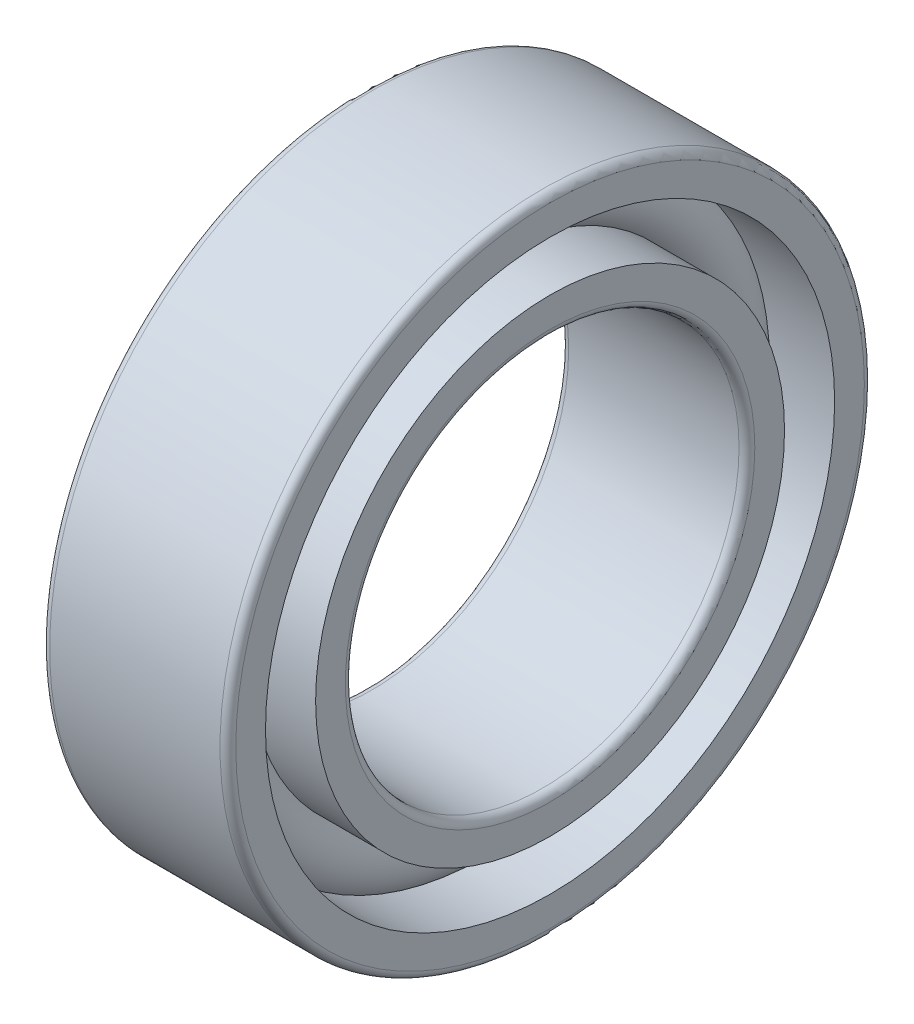
ISO-10303-21;
HEADER;
FILE_DESCRIPTION(('STEP AP214'),'2;1');
FILE_NAME('part.step','',(''),(''),'','','');
FILE_SCHEMA(('AUTOMOTIVE_DESIGN { 1 0 10303 214 1 1 1 1 }'));
ENDSEC;
DATA;
#1=APPLICATION_CONTEXT('core data for automotive mechanical design processes');
#2=APPLICATION_PROTOCOL_DEFINITION('international standard','automotive_design',2000,#1);
#3=PRODUCT_CONTEXT('',#1,'mechanical');
#4=PRODUCT('Part','Part','',(#3));
#5=PRODUCT_RELATED_PRODUCT_CATEGORY('part','',(#4));
#6=PRODUCT_DEFINITION_FORMATION('','',#4);
#7=PRODUCT_DEFINITION_CONTEXT('part definition',#1,'design');
#8=PRODUCT_DEFINITION('design','',#6,#7);
#9=PRODUCT_DEFINITION_SHAPE('','',#8);
#10=(LENGTH_UNIT() NAMED_UNIT(*) SI_UNIT(.MILLI.,.METRE.));
#11=(NAMED_UNIT(*) PLANE_ANGLE_UNIT() SI_UNIT($,.RADIAN.));
#12=(NAMED_UNIT(*) SI_UNIT($,.STERADIAN.) SOLID_ANGLE_UNIT());
#13=UNCERTAINTY_MEASURE_WITH_UNIT(LENGTH_MEASURE(1.E-05),#10,'distance_accuracy_value','');
#14=(GEOMETRIC_REPRESENTATION_CONTEXT(3) GLOBAL_UNCERTAINTY_ASSIGNED_CONTEXT((#13)) GLOBAL_UNIT_ASSIGNED_CONTEXT((#10,
#11,#12)) REPRESENTATION_CONTEXT('',''));
#15=CARTESIAN_POINT('',(0.,0.,0.));
#16=DIRECTION('',(0.,0.,1.));
#17=DIRECTION('',(1.,0.,0.));
#18=AXIS2_PLACEMENT_3D('',#15,#16,#17);
#19=CARTESIAN_POINT('',(0.,0.,0.));
#20=DIRECTION('',(-1.,0.,0.));
#21=DIRECTION('',(0.,0.,1.));
#22=AXIS2_PLACEMENT_3D('',#19,#20,#21);
#23=TOROIDAL_SURFACE('',#22,36.25,5.25);
#24=CARTESIAN_POINT('',(3.91311896062462,0.,0.));
#25=DIRECTION('',(-1.,0.,0.));
#26=DIRECTION('',(0.,0.,1.));
#27=AXIS2_PLACEMENT_3D('',#24,#25,#26);
#28=CIRCLE('',#27,39.75);
#29=CARTESIAN_POINT('',(3.91311896062462,0.,39.75));
#30=VERTEX_POINT('',#29);
#31=EDGE_CURVE('E35',#30,#30,#28,.F.);
#32=ORIENTED_EDGE('',*,*,#31,.T.);
#33=EDGE_LOOP('',(#32));
#34=FACE_BOUND('',#33,.T.);
#35=CARTESIAN_POINT('',(3.91311896062463,0.,0.));
#36=DIRECTION('',(-1.,0.,0.));
#37=DIRECTION('',(0.,0.,1.));
#38=AXIS2_PLACEMENT_3D('',#35,#36,#37);
#39=CIRCLE('',#38,32.75);
#40=CARTESIAN_POINT('',(3.91311896062463,0.,32.75));
#41=VERTEX_POINT('',#40);
#42=EDGE_CURVE('E10',#41,#41,#39,.T.);
#43=ORIENTED_EDGE('',*,*,#42,.T.);
#44=EDGE_LOOP('',(#43));
#45=FACE_BOUND('',#44,.T.);
#46=ADVANCED_FACE('F31',(#34,#45),#23,.T.);
#47=CARTESIAN_POINT('',(-20.6375,0.,0.));
#48=DIRECTION('',(1.,0.,0.));
#49=DIRECTION('',(0.,0.,-1.));
#50=AXIS2_PLACEMENT_3D('',#47,#48,#49);
#51=CYLINDRICAL_SURFACE('',#50,32.75);
#52=CARTESIAN_POINT('',(13.,0.,0.));
#53=DIRECTION('',(1.,0.,0.));
#54=DIRECTION('',(0.,0.,-1.));
#55=AXIS2_PLACEMENT_3D('',#52,#53,#54);
#56=CIRCLE('',#55,32.75);
#57=CARTESIAN_POINT('',(13.,0.,-32.75));
#58=VERTEX_POINT('',#57);
#59=EDGE_CURVE('E44',#58,#58,#56,.T.);
#60=ORIENTED_EDGE('',*,*,#59,.F.);
#61=EDGE_LOOP('',(#60));
#62=FACE_BOUND('',#61,.T.);
#63=ORIENTED_EDGE('',*,*,#42,.F.);
#64=EDGE_LOOP('',(#63));
#65=FACE_BOUND('',#64,.T.);
#66=ADVANCED_FACE('F83',(#62,#65),#51,.T.);
#67=CARTESIAN_POINT('',(-20.6375,0.,0.));
#68=DIRECTION('',(1.,0.,0.));
#69=DIRECTION('',(0.,0.,-1.));
#70=AXIS2_PLACEMENT_3D('',#67,#68,#69);
#71=CYLINDRICAL_SURFACE('',#70,32.75);
#72=CARTESIAN_POINT('',(-13.,0.,0.));
#73=DIRECTION('',(1.,0.,0.));
#74=DIRECTION('',(0.,0.,-1.));
#75=AXIS2_PLACEMENT_3D('',#72,#73,#74);
#76=CIRCLE('',#75,32.75);
#77=CARTESIAN_POINT('',(-13.,0.,-32.75));
#78=VERTEX_POINT('',#77);
#79=EDGE_CURVE('E53',#78,#78,#76,.T.);
#80=ORIENTED_EDGE('',*,*,#79,.T.);
#81=EDGE_LOOP('',(#80));
#82=FACE_BOUND('',#81,.T.);
#83=CARTESIAN_POINT('',(-3.91311896062463,0.,0.));
#84=DIRECTION('',(1.,0.,0.));
#85=DIRECTION('',(0.,0.,-1.));
#86=AXIS2_PLACEMENT_3D('',#83,#84,#85);
#87=CIRCLE('',#86,32.75);
#88=CARTESIAN_POINT('',(-3.91311896062463,0.,-32.75));
#89=VERTEX_POINT('',#88);
#90=EDGE_CURVE('E39',#89,#89,#87,.T.);
#91=ORIENTED_EDGE('',*,*,#90,.F.);
#92=EDGE_LOOP('',(#91));
#93=FACE_BOUND('',#92,.T.);
#94=ADVANCED_FACE('F86',(#82,#93),#71,.T.);
#95=CARTESIAN_POINT('',(13.,28.6,0.));
#96=DIRECTION('',(1.,0.,0.));
#97=DIRECTION('',(0.,0.,-1.));
#98=AXIS2_PLACEMENT_3D('',#95,#96,#97);
#99=PLANE('',#98);
#100=ORIENTED_EDGE('',*,*,#59,.T.);
#101=EDGE_LOOP('',(#100));
#102=FACE_BOUND('',#101,.T.);
#103=CARTESIAN_POINT('',(13.,0.,0.));
#104=DIRECTION('',(1.,0.,0.));
#105=DIRECTION('',(0.,0.,-1.));
#106=AXIS2_PLACEMENT_3D('',#103,#104,#105);
#107=CIRCLE('',#106,28.6);
#108=CARTESIAN_POINT('',(13.,0.,-28.6));
#109=VERTEX_POINT('',#108);
#110=EDGE_CURVE('E75',#109,#109,#107,.T.);
#111=ORIENTED_EDGE('',*,*,#110,.F.);
#112=EDGE_LOOP('',(#111));
#113=FACE_BOUND('',#112,.T.);
#114=ADVANCED_FACE('F80',(#102,#113),#99,.T.);
#115=CARTESIAN_POINT('',(11.9,0.,0.));
#116=DIRECTION('',(1.,0.,0.));
#117=DIRECTION('',(0.,0.,-1.));
#118=AXIS2_PLACEMENT_3D('',#115,#116,#117);
#119=TOROIDAL_SURFACE('',#118,28.6,1.1);
#120=ORIENTED_EDGE('',*,*,#110,.T.);
#121=EDGE_LOOP('',(#120));
#122=FACE_BOUND('',#121,.T.);
#123=CARTESIAN_POINT('',(11.9,0.,0.));
#124=DIRECTION('',(1.,0.,0.));
#125=DIRECTION('',(0.,0.,-1.));
#126=AXIS2_PLACEMENT_3D('',#123,#124,#125);
#127=CIRCLE('',#126,27.5);
#128=CARTESIAN_POINT('',(11.9,0.,-27.5));
#129=VERTEX_POINT('',#128);
#130=EDGE_CURVE('E72',#129,#129,#127,.T.);
#131=ORIENTED_EDGE('',*,*,#130,.F.);
#132=EDGE_LOOP('',(#131));
#133=FACE_BOUND('',#132,.T.);
#134=ADVANCED_FACE('F97',(#122,#133),#119,.T.);
#135=CARTESIAN_POINT('',(-20.6375,0.,0.));
#136=DIRECTION('',(1.,0.,0.));
#137=DIRECTION('',(0.,0.,-1.));
#138=AXIS2_PLACEMENT_3D('',#135,#136,#137);
#139=CYLINDRICAL_SURFACE('',#138,27.5);
#140=ORIENTED_EDGE('',*,*,#130,.T.);
#141=EDGE_LOOP('',(#140));
#142=FACE_BOUND('',#141,.T.);
#143=CARTESIAN_POINT('',(-11.9,0.,0.));
#144=DIRECTION('',(1.,0.,0.));
#145=DIRECTION('',(0.,0.,-1.));
#146=AXIS2_PLACEMENT_3D('',#143,#144,#145);
#147=CIRCLE('',#146,27.5);
#148=CARTESIAN_POINT('',(-11.9,0.,-27.5));
#149=VERTEX_POINT('',#148);
#150=EDGE_CURVE('E69',#149,#149,#147,.T.);
#151=ORIENTED_EDGE('',*,*,#150,.F.);
#152=EDGE_LOOP('',(#151));
#153=FACE_BOUND('',#152,.T.);
#154=ADVANCED_FACE('F100',(#142,#153),#139,.F.);
#155=CARTESIAN_POINT('',(-11.9,0.,0.));
#156=DIRECTION('',(1.,0.,0.));
#157=DIRECTION('',(0.,0.,-1.));
#158=AXIS2_PLACEMENT_3D('',#155,#156,#157);
#159=TOROIDAL_SURFACE('',#158,28.6,1.1);
#160=ORIENTED_EDGE('',*,*,#150,.T.);
#161=EDGE_LOOP('',(#160));
#162=FACE_BOUND('',#161,.T.);
#163=CARTESIAN_POINT('',(-13.,0.,0.));
#164=DIRECTION('',(1.,0.,0.));
#165=DIRECTION('',(0.,0.,-1.));
#166=AXIS2_PLACEMENT_3D('',#163,#164,#165);
#167=CIRCLE('',#166,28.6);
#168=CARTESIAN_POINT('',(-13.,0.,-28.6));
#169=VERTEX_POINT('',#168);
#170=EDGE_CURVE('E66',#169,#169,#167,.T.);
#171=ORIENTED_EDGE('',*,*,#170,.F.);
#172=EDGE_LOOP('',(#171));
#173=FACE_BOUND('',#172,.T.);
#174=ADVANCED_FACE('F104',(#162,#173),#159,.T.);
#175=CARTESIAN_POINT('',(-13.,32.75,0.));
#176=DIRECTION('',(-1.,0.,0.));
#177=DIRECTION('',(0.,0.,1.));
#178=AXIS2_PLACEMENT_3D('',#175,#176,#177);
#179=PLANE('',#178);
#180=ORIENTED_EDGE('',*,*,#170,.T.);
#181=EDGE_LOOP('',(#180));
#182=FACE_BOUND('',#181,.T.);
#183=ORIENTED_EDGE('',*,*,#79,.F.);
#184=EDGE_LOOP('',(#183));
#185=FACE_BOUND('',#184,.T.);
#186=ADVANCED_FACE('F108',(#182,#185),#179,.T.);
#187=CARTESIAN_POINT('',(-3.91311896062462,0.,0.));
#188=DIRECTION('',(1.,0.,0.));
#189=DIRECTION('',(0.,0.,-1.));
#190=AXIS2_PLACEMENT_3D('',#187,#188,#189);
#191=CIRCLE('',#190,39.75);
#192=CARTESIAN_POINT('',(-3.91311896062462,0.,-39.75));
#193=VERTEX_POINT('',#192);
#194=EDGE_CURVE('E47',#193,#193,#191,.F.);
#195=ORIENTED_EDGE('',*,*,#194,.T.);
#196=EDGE_LOOP('',(#195));
#197=FACE_BOUND('',#196,.T.);
#198=ORIENTED_EDGE('',*,*,#90,.T.);
#199=EDGE_LOOP('',(#198));
#200=FACE_BOUND('',#199,.T.);
#201=ADVANCED_FACE('F33',(#197,#200),#23,.T.);
#202=CARTESIAN_POINT('',(-20.6375,0.,0.));
#203=DIRECTION('',(1.,0.,0.));
#204=DIRECTION('',(0.,0.,-1.));
#205=AXIS2_PLACEMENT_3D('',#202,#203,#204);
#206=CYLINDRICAL_SURFACE('',#205,39.75);
#207=CARTESIAN_POINT('',(13.,0.,0.));
#208=DIRECTION('',(1.,0.,0.));
#209=DIRECTION('',(0.,0.,-1.));
#210=AXIS2_PLACEMENT_3D('',#207,#208,#209);
#211=CIRCLE('',#210,39.75);
#212=CARTESIAN_POINT('',(13.,0.,-39.75));
#213=VERTEX_POINT('',#212);
#214=EDGE_CURVE('E49',#213,#213,#211,.T.);
#215=ORIENTED_EDGE('',*,*,#214,.T.);
#216=EDGE_LOOP('',(#215));
#217=FACE_BOUND('',#216,.T.);
#218=ORIENTED_EDGE('',*,*,#31,.F.);
#219=EDGE_LOOP('',(#218));
#220=FACE_BOUND('',#219,.T.);
#221=ADVANCED_FACE('F113',(#217,#220),#206,.F.);
#222=CARTESIAN_POINT('',(-20.6375,0.,0.));
#223=DIRECTION('',(1.,0.,0.));
#224=DIRECTION('',(0.,0.,-1.));
#225=AXIS2_PLACEMENT_3D('',#222,#223,#224);
#226=CYLINDRICAL_SURFACE('',#225,39.75);
#227=CARTESIAN_POINT('',(-13.,0.,0.));
#228=DIRECTION('',(1.,0.,0.));
#229=DIRECTION('',(0.,0.,-1.));
#230=AXIS2_PLACEMENT_3D('',#227,#228,#229);
#231=CIRCLE('',#230,39.75);
#232=CARTESIAN_POINT('',(-13.,0.,-39.75));
#233=VERTEX_POINT('',#232);
#234=EDGE_CURVE('E144',#233,#233,#231,.T.);
#235=ORIENTED_EDGE('',*,*,#234,.F.);
#236=EDGE_LOOP('',(#235));
#237=FACE_BOUND('',#236,.T.);
#238=ORIENTED_EDGE('',*,*,#194,.F.);
#239=EDGE_LOOP('',(#238));
#240=FACE_BOUND('',#239,.T.);
#241=ADVANCED_FACE('F116',(#237,#240),#226,.F.);
#242=CARTESIAN_POINT('',(13.,43.9,0.));
#243=DIRECTION('',(1.,0.,0.));
#244=DIRECTION('',(0.,0.,-1.));
#245=AXIS2_PLACEMENT_3D('',#242,#243,#244);
#246=PLANE('',#245);
#247=CARTESIAN_POINT('',(13.,0.,0.));
#248=DIRECTION('',(1.,0.,0.));
#249=DIRECTION('',(0.,0.,-1.));
#250=AXIS2_PLACEMENT_3D('',#247,#248,#249);
#251=CIRCLE('',#250,43.9);
#252=CARTESIAN_POINT('',(13.,0.,-43.9));
#253=VERTEX_POINT('',#252);
#254=EDGE_CURVE('E55',#253,#253,#251,.T.);
#255=ORIENTED_EDGE('',*,*,#254,.T.);
#256=EDGE_LOOP('',(#255));
#257=FACE_BOUND('',#256,.T.);
#258=ORIENTED_EDGE('',*,*,#214,.F.);
#259=EDGE_LOOP('',(#258));
#260=FACE_BOUND('',#259,.T.);
#261=ADVANCED_FACE('F117',(#257,#260),#246,.T.);
#262=CARTESIAN_POINT('',(11.9,0.,0.));
#263=DIRECTION('',(1.,0.,0.));
#264=DIRECTION('',(0.,0.,-1.));
#265=AXIS2_PLACEMENT_3D('',#262,#263,#264);
#266=TOROIDAL_SURFACE('',#265,43.9,1.1);
#267=CARTESIAN_POINT('',(11.9,0.,0.));
#268=DIRECTION('',(1.,0.,0.));
#269=DIRECTION('',(0.,0.,-1.));
#270=AXIS2_PLACEMENT_3D('',#267,#268,#269);
#271=CIRCLE('',#270,45.);
#272=CARTESIAN_POINT('',(11.9,0.,-45.));
#273=VERTEX_POINT('',#272);
#274=EDGE_CURVE('E60',#273,#273,#271,.T.);
#275=ORIENTED_EDGE('',*,*,#274,.T.);
#276=EDGE_LOOP('',(#275));
#277=FACE_BOUND('',#276,.T.);
#278=ORIENTED_EDGE('',*,*,#254,.F.);
#279=EDGE_LOOP('',(#278));
#280=FACE_BOUND('',#279,.T.);
#281=ADVANCED_FACE('F120',(#277,#280),#266,.T.);
#282=CARTESIAN_POINT('',(-20.6375,0.,0.));
#283=DIRECTION('',(1.,0.,0.));
#284=DIRECTION('',(0.,0.,-1.));
#285=AXIS2_PLACEMENT_3D('',#282,#283,#284);
#286=CYLINDRICAL_SURFACE('',#285,45.);
#287=CARTESIAN_POINT('',(-11.9,0.,0.));
#288=DIRECTION('',(1.,0.,0.));
#289=DIRECTION('',(0.,0.,-1.));
#290=AXIS2_PLACEMENT_3D('',#287,#288,#289);
#291=CIRCLE('',#290,45.);
#292=CARTESIAN_POINT('',(-11.9,0.,-45.));
#293=VERTEX_POINT('',#292);
#294=EDGE_CURVE('E148',#293,#293,#291,.T.);
#295=ORIENTED_EDGE('',*,*,#294,.T.);
#296=EDGE_LOOP('',(#295));
#297=FACE_BOUND('',#296,.T.);
#298=ORIENTED_EDGE('',*,*,#274,.F.);
#299=EDGE_LOOP('',(#298));
#300=FACE_BOUND('',#299,.T.);
#301=ADVANCED_FACE('F124',(#297,#300),#286,.T.);
#302=CARTESIAN_POINT('',(-11.9,0.,0.));
#303=DIRECTION('',(1.,0.,0.));
#304=DIRECTION('',(0.,0.,-1.));
#305=AXIS2_PLACEMENT_3D('',#302,#303,#304);
#306=TOROIDAL_SURFACE('',#305,43.9,1.1);
#307=CARTESIAN_POINT('',(-13.,0.,0.));
#308=DIRECTION('',(1.,0.,0.));
#309=DIRECTION('',(0.,0.,-1.));
#310=AXIS2_PLACEMENT_3D('',#307,#308,#309);
#311=CIRCLE('',#310,43.9);
#312=CARTESIAN_POINT('',(-13.,0.,-43.9));
#313=VERTEX_POINT('',#312);
#314=EDGE_CURVE('E145',#313,#313,#311,.T.);
#315=ORIENTED_EDGE('',*,*,#314,.T.);
#316=EDGE_LOOP('',(#315));
#317=FACE_BOUND('',#316,.T.);
#318=ORIENTED_EDGE('',*,*,#294,.F.);
#319=EDGE_LOOP('',(#318));
#320=FACE_BOUND('',#319,.T.);
#321=ADVANCED_FACE('F128',(#317,#320),#306,.T.);
#322=CARTESIAN_POINT('',(-13.,39.75,0.));
#323=DIRECTION('',(-1.,0.,0.));
#324=DIRECTION('',(0.,0.,1.));
#325=AXIS2_PLACEMENT_3D('',#322,#323,#324);
#326=PLANE('',#325);
#327=ORIENTED_EDGE('',*,*,#234,.T.);
#328=EDGE_LOOP('',(#327));
#329=FACE_BOUND('',#328,.T.);
#330=ORIENTED_EDGE('',*,*,#314,.F.);
#331=EDGE_LOOP('',(#330));
#332=FACE_BOUND('',#331,.T.);
#333=ADVANCED_FACE('F132',(#329,#332),#326,.T.);
#334=CLOSED_SHELL('',(#46,#66,#94,#114,#134,#154,#174,#186,#201,#221,#241,#261,#281,#301,#321,#333));
#335=MANIFOLD_SOLID_BREP('B2',#334);
#336=ADVANCED_BREP_SHAPE_REPRESENTATION('',(#18,#335),#14);
#337=SHAPE_DEFINITION_REPRESENTATION(#9,#336);
ENDSEC;
END-ISO-10303-21;
